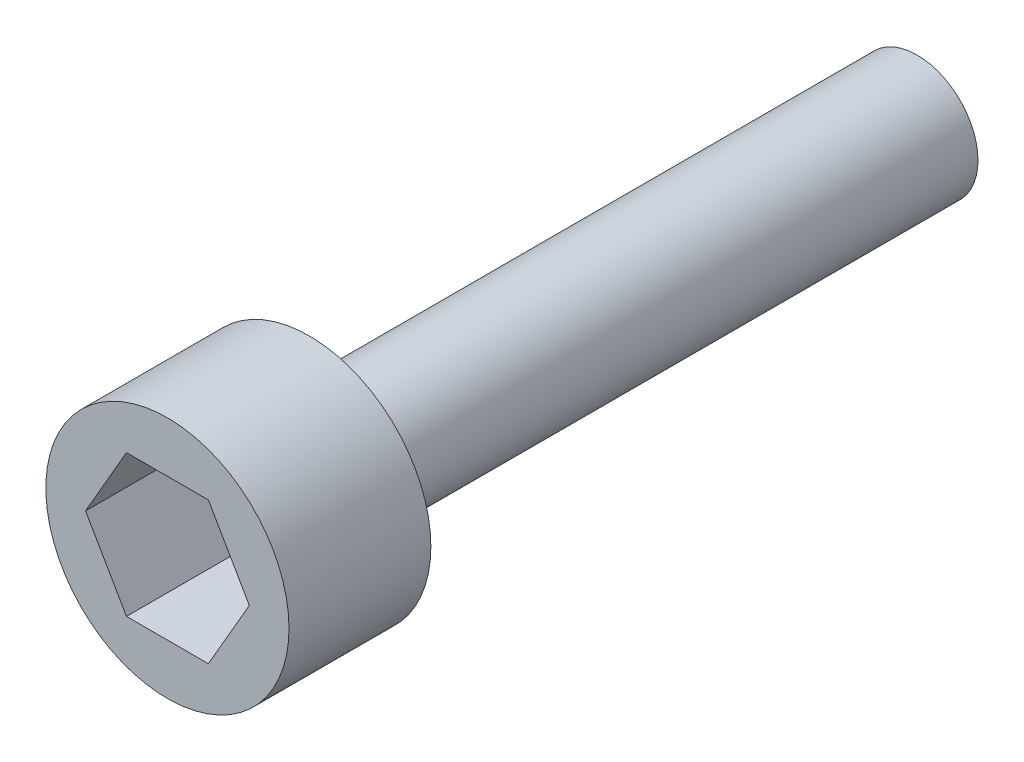
ISO-10303-21;
HEADER;
FILE_DESCRIPTION(('STEP AP214'),'2;1');
FILE_NAME('part.step','',(''),(''),'','','');
FILE_SCHEMA(('AUTOMOTIVE_DESIGN { 1 0 10303 214 1 1 1 1 }'));
ENDSEC;
DATA;
#1=APPLICATION_CONTEXT('core data for automotive mechanical design processes');
#2=APPLICATION_PROTOCOL_DEFINITION('international standard','automotive_design',2000,#1);
#3=PRODUCT_CONTEXT('',#1,'mechanical');
#4=PRODUCT('Part','Part','',(#3));
#5=PRODUCT_RELATED_PRODUCT_CATEGORY('part','',(#4));
#6=PRODUCT_DEFINITION_FORMATION('','',#4);
#7=PRODUCT_DEFINITION_CONTEXT('part definition',#1,'design');
#8=PRODUCT_DEFINITION('design','',#6,#7);
#9=PRODUCT_DEFINITION_SHAPE('','',#8);
#10=(LENGTH_UNIT() NAMED_UNIT(*) SI_UNIT(.MILLI.,.METRE.));
#11=(NAMED_UNIT(*) PLANE_ANGLE_UNIT() SI_UNIT($,.RADIAN.));
#12=(NAMED_UNIT(*) SI_UNIT($,.STERADIAN.) SOLID_ANGLE_UNIT());
#13=UNCERTAINTY_MEASURE_WITH_UNIT(LENGTH_MEASURE(1.E-05),#10,'distance_accuracy_value','');
#14=(GEOMETRIC_REPRESENTATION_CONTEXT(3) GLOBAL_UNCERTAINTY_ASSIGNED_CONTEXT((#13)) GLOBAL_UNIT_ASSIGNED_CONTEXT((#10,
#11,#12)) REPRESENTATION_CONTEXT('',''));
#15=CARTESIAN_POINT('',(0.,0.,0.));
#16=DIRECTION('',(0.,0.,1.));
#17=DIRECTION('',(1.,0.,0.));
#18=AXIS2_PLACEMENT_3D('',#15,#16,#17);
#19=CARTESIAN_POINT('',(0.,0.,3.5));
#20=DIRECTION('',(0.,0.,-1.));
#21=DIRECTION('',(-1.,0.,0.));
#22=AXIS2_PLACEMENT_3D('',#19,#20,#21);
#23=CYLINDRICAL_SURFACE('',#22,3.);
#24=CARTESIAN_POINT('',(0.,0.,3.5));
#25=DIRECTION('',(0.,0.,1.));
#26=DIRECTION('',(1.,0.,0.));
#27=AXIS2_PLACEMENT_3D('',#24,#25,#26);
#28=CIRCLE('',#27,3.);
#29=CARTESIAN_POINT('',(3.,0.,3.5));
#30=VERTEX_POINT('',#29);
#31=EDGE_CURVE('E11',#30,#30,#28,.T.);
#32=ORIENTED_EDGE('',*,*,#31,.F.);
#33=EDGE_LOOP('',(#32));
#34=FACE_BOUND('',#33,.T.);
#35=CARTESIAN_POINT('',(0.,0.,0.));
#36=DIRECTION('',(0.,0.,1.));
#37=DIRECTION('',(1.,0.,0.));
#38=AXIS2_PLACEMENT_3D('',#35,#36,#37);
#39=CIRCLE('',#38,3.);
#40=CARTESIAN_POINT('',(3.,0.,0.));
#41=VERTEX_POINT('',#40);
#42=EDGE_CURVE('E38',#41,#41,#39,.T.);
#43=ORIENTED_EDGE('',*,*,#42,.T.);
#44=EDGE_LOOP('',(#43));
#45=FACE_BOUND('',#44,.T.);
#46=ADVANCED_FACE('F35',(#34,#45),#23,.T.);
#47=CARTESIAN_POINT('',(0.,0.,3.5));
#48=DIRECTION('',(0.,0.,1.));
#49=DIRECTION('',(1.,0.,0.));
#50=AXIS2_PLACEMENT_3D('',#47,#48,#49);
#51=PLANE('',#50);
#52=DIRECTION('',(-0.499999999999528,-0.866025403784711,0.));
#53=VECTOR('',#52,1.);
#54=CARTESIAN_POINT('',(-2.02072594216261,2.1557411053031E-12,3.5));
#55=LINE('',#54,#53);
#56=CARTESIAN_POINT('',(-1.01036297108294,1.75000000000058,3.5));
#57=VERTEX_POINT('',#56);
#58=CARTESIAN_POINT('',(-2.02072594216261,2.15561075933568E-12,3.5));
#59=VERTEX_POINT('',#58);
#60=EDGE_CURVE('E49',#57,#59,#55,.T.);
#61=ORIENTED_EDGE('',*,*,#60,.F.);
#62=DIRECTION('',(-1.,-7.11024037944377E-13,0.));
#63=VECTOR('',#62,1.);
#64=CARTESIAN_POINT('',(-1.01036297108294,1.75000000000058,3.5));
#65=LINE('',#64,#63);
#66=CARTESIAN_POINT('',(1.01036297108301,1.75000000000202,3.5));
#67=VERTEX_POINT('',#66);
#68=EDGE_CURVE('E133',#67,#57,#65,.T.);
#69=ORIENTED_EDGE('',*,*,#68,.F.);
#70=DIRECTION('',(-0.50000000000043,0.86602540378419,0.));
#71=VECTOR('',#70,1.);
#72=CARTESIAN_POINT('',(1.01036297108301,1.75000000000202,3.5));
#73=LINE('',#72,#71);
#74=CARTESIAN_POINT('',(2.02072594216593,2.15574110530311E-12,3.5));
#75=VERTEX_POINT('',#74);
#76=EDGE_CURVE('E131',#75,#67,#73,.T.);
#77=ORIENTED_EDGE('',*,*,#76,.F.);
#78=DIRECTION('',(0.499999999999527,0.866025403784711,0.));
#79=VECTOR('',#78,1.);
#80=CARTESIAN_POINT('',(2.02072594216593,2.15574110530311E-12,3.5));
#81=LINE('',#80,#79);
#82=CARTESIAN_POINT('',(1.01036297108301,-1.75000000000192,3.5));
#83=VERTEX_POINT('',#82);
#84=EDGE_CURVE('E97',#83,#75,#81,.T.);
#85=ORIENTED_EDGE('',*,*,#84,.F.);
#86=DIRECTION('',(1.,7.11024037946673E-13,0.));
#87=VECTOR('',#86,1.);
#88=CARTESIAN_POINT('',(1.01036297108301,-1.75000000000192,3.5));
#89=LINE('',#88,#87);
#90=CARTESIAN_POINT('',(-1.01036297107642,-1.75000000000336,3.5));
#91=VERTEX_POINT('',#90);
#92=EDGE_CURVE('E127',#91,#83,#89,.T.);
#93=ORIENTED_EDGE('',*,*,#92,.F.);
#94=DIRECTION('',(0.500000000000431,-0.86602540378419,0.));
#95=VECTOR('',#94,1.);
#96=CARTESIAN_POINT('',(-1.01036297107642,-1.75000000000336,3.5));
#97=LINE('',#96,#95);
#98=EDGE_CURVE('E123',#59,#91,#97,.T.);
#99=ORIENTED_EDGE('',*,*,#98,.F.);
#100=EDGE_LOOP('',(#61,#69,#77,#85,#93,#99));
#101=FACE_BOUND('',#100,.T.);
#102=ORIENTED_EDGE('',*,*,#31,.T.);
#103=EDGE_LOOP('',(#102));
#104=FACE_BOUND('',#103,.T.);
#105=ADVANCED_FACE('F146',(#101,#104),#51,.T.);
#106=CARTESIAN_POINT('',(0.,0.,0.));
#107=DIRECTION('',(0.,0.,1.));
#108=DIRECTION('',(1.,0.,0.));
#109=AXIS2_PLACEMENT_3D('',#106,#107,#108);
#110=PLANE('',#109);
#111=CARTESIAN_POINT('',(0.,0.,0.));
#112=DIRECTION('',(0.,0.,1.));
#113=DIRECTION('',(1.,0.,0.));
#114=AXIS2_PLACEMENT_3D('',#111,#112,#113);
#115=CIRCLE('',#114,1.5);
#116=CARTESIAN_POINT('',(1.5,0.,0.));
#117=VERTEX_POINT('',#116);
#118=EDGE_CURVE('E153',#117,#117,#115,.T.);
#119=ORIENTED_EDGE('',*,*,#118,.T.);
#120=EDGE_LOOP('',(#119));
#121=FACE_BOUND('',#120,.T.);
#122=ORIENTED_EDGE('',*,*,#42,.F.);
#123=EDGE_LOOP('',(#122));
#124=FACE_BOUND('',#123,.T.);
#125=ADVANCED_FACE('F174',(#121,#124),#110,.F.);
#126=CARTESIAN_POINT('',(-2.02072594216261,2.1557411053031E-12,0.7));
#127=DIRECTION('',(-0.866025403784711,0.499999999999528,0.));
#128=DIRECTION('',(-0.499999999999528,-0.866025403784711,0.));
#129=AXIS2_PLACEMENT_3D('',#126,#127,#128);
#130=PLANE('',#129);
#131=ORIENTED_EDGE('',*,*,#60,.T.);
#132=DIRECTION('',(0.,0.,1.));
#133=VECTOR('',#132,1.);
#134=CARTESIAN_POINT('',(-2.02072594216261,2.1557411053031E-12,0.7));
#135=LINE('',#134,#133);
#136=CARTESIAN_POINT('',(-2.02072594216261,2.1557411053031E-12,0.7));
#137=VERTEX_POINT('',#136);
#138=EDGE_CURVE('E79',#137,#59,#135,.T.);
#139=ORIENTED_EDGE('',*,*,#138,.F.);
#140=DIRECTION('',(-0.499999999999528,-0.866025403784711,0.));
#141=VECTOR('',#140,1.);
#142=CARTESIAN_POINT('',(-2.02072594216261,2.1557411053031E-12,0.7));
#143=LINE('',#142,#141);
#144=CARTESIAN_POINT('',(-1.01036297108294,1.75000000000058,0.7));
#145=VERTEX_POINT('',#144);
#146=EDGE_CURVE('E135',#145,#137,#143,.T.);
#147=ORIENTED_EDGE('',*,*,#146,.F.);
#148=DIRECTION('',(0.,0.,1.));
#149=VECTOR('',#148,1.);
#150=CARTESIAN_POINT('',(-1.01036297108294,1.75000000000058,0.7));
#151=LINE('',#150,#149);
#152=EDGE_CURVE('E57',#145,#57,#151,.T.);
#153=ORIENTED_EDGE('',*,*,#152,.T.);
#154=EDGE_LOOP('',(#131,#139,#147,#153));
#155=FACE_BOUND('',#154,.T.);
#156=ADVANCED_FACE('F182',(#155),#130,.F.);
#157=CARTESIAN_POINT('',(-1.01036297108294,1.75000000000058,0.7));
#158=DIRECTION('',(-7.11024037944377E-13,1.,0.));
#159=DIRECTION('',(-1.,-7.11024037944377E-13,0.));
#160=AXIS2_PLACEMENT_3D('',#157,#158,#159);
#161=PLANE('',#160);
#162=ORIENTED_EDGE('',*,*,#68,.T.);
#163=ORIENTED_EDGE('',*,*,#152,.F.);
#164=DIRECTION('',(-1.,-7.11024037944377E-13,0.));
#165=VECTOR('',#164,1.);
#166=CARTESIAN_POINT('',(-1.01036297108294,1.75000000000058,0.7));
#167=LINE('',#166,#165);
#168=CARTESIAN_POINT('',(1.01036297108301,1.75000000000202,0.7));
#169=VERTEX_POINT('',#168);
#170=EDGE_CURVE('E109',#169,#145,#167,.T.);
#171=ORIENTED_EDGE('',*,*,#170,.F.);
#172=DIRECTION('',(0.,0.,1.));
#173=VECTOR('',#172,1.);
#174=CARTESIAN_POINT('',(1.01036297108301,1.75000000000202,0.7));
#175=LINE('',#174,#173);
#176=EDGE_CURVE('E101',#169,#67,#175,.T.);
#177=ORIENTED_EDGE('',*,*,#176,.T.);
#178=EDGE_LOOP('',(#162,#163,#171,#177));
#179=FACE_BOUND('',#178,.T.);
#180=ADVANCED_FACE('F187',(#179),#161,.F.);
#181=CARTESIAN_POINT('',(1.01036297108301,1.75000000000202,0.7));
#182=DIRECTION('',(0.86602540378419,0.50000000000043,0.));
#183=DIRECTION('',(-0.50000000000043,0.86602540378419,0.));
#184=AXIS2_PLACEMENT_3D('',#181,#182,#183);
#185=PLANE('',#184);
#186=ORIENTED_EDGE('',*,*,#76,.T.);
#187=ORIENTED_EDGE('',*,*,#176,.F.);
#188=DIRECTION('',(-0.50000000000043,0.86602540378419,0.));
#189=VECTOR('',#188,1.);
#190=CARTESIAN_POINT('',(1.01036297108301,1.75000000000202,0.7));
#191=LINE('',#190,#189);
#192=CARTESIAN_POINT('',(2.02072594216593,2.15574110530311E-12,0.7));
#193=VERTEX_POINT('',#192);
#194=EDGE_CURVE('E105',#193,#169,#191,.T.);
#195=ORIENTED_EDGE('',*,*,#194,.F.);
#196=DIRECTION('',(0.,0.,1.));
#197=VECTOR('',#196,1.);
#198=CARTESIAN_POINT('',(2.02072594216593,2.15574110530311E-12,0.7));
#199=LINE('',#198,#197);
#200=EDGE_CURVE('E90',#193,#75,#199,.T.);
#201=ORIENTED_EDGE('',*,*,#200,.T.);
#202=EDGE_LOOP('',(#186,#187,#195,#201));
#203=FACE_BOUND('',#202,.T.);
#204=ADVANCED_FACE('F106',(#203),#185,.F.);
#205=CARTESIAN_POINT('',(2.02072594216593,2.15574110530311E-12,0.7));
#206=DIRECTION('',(0.866025403784712,-0.499999999999527,0.));
#207=DIRECTION('',(0.499999999999527,0.866025403784712,0.));
#208=AXIS2_PLACEMENT_3D('',#205,#206,#207);
#209=PLANE('',#208);
#210=ORIENTED_EDGE('',*,*,#84,.T.);
#211=ORIENTED_EDGE('',*,*,#200,.F.);
#212=DIRECTION('',(0.499999999999527,0.866025403784711,0.));
#213=VECTOR('',#212,1.);
#214=CARTESIAN_POINT('',(2.02072594216593,2.15574110530311E-12,0.7));
#215=LINE('',#214,#213);
#216=CARTESIAN_POINT('',(1.01036297108301,-1.75000000000192,0.7));
#217=VERTEX_POINT('',#216);
#218=EDGE_CURVE('E94',#217,#193,#215,.T.);
#219=ORIENTED_EDGE('',*,*,#218,.F.);
#220=DIRECTION('',(0.,0.,1.));
#221=VECTOR('',#220,1.);
#222=CARTESIAN_POINT('',(1.01036297108301,-1.75000000000192,0.7));
#223=LINE('',#222,#221);
#224=EDGE_CURVE('E102',#217,#83,#223,.T.);
#225=ORIENTED_EDGE('',*,*,#224,.T.);
#226=EDGE_LOOP('',(#210,#211,#219,#225));
#227=FACE_BOUND('',#226,.T.);
#228=ADVANCED_FACE('F92',(#227),#209,.F.);
#229=CARTESIAN_POINT('',(1.01036297108301,-1.75000000000192,0.7));
#230=DIRECTION('',(7.11024037946673E-13,-1.,0.));
#231=DIRECTION('',(1.,7.11024037946673E-13,0.));
#232=AXIS2_PLACEMENT_3D('',#229,#230,#231);
#233=PLANE('',#232);
#234=ORIENTED_EDGE('',*,*,#92,.T.);
#235=ORIENTED_EDGE('',*,*,#224,.F.);
#236=DIRECTION('',(1.,7.11024037946673E-13,0.));
#237=VECTOR('',#236,1.);
#238=CARTESIAN_POINT('',(1.01036297108301,-1.75000000000192,0.7));
#239=LINE('',#238,#237);
#240=CARTESIAN_POINT('',(-1.01036297107642,-1.75000000000336,0.7));
#241=VERTEX_POINT('',#240);
#242=EDGE_CURVE('E115',#241,#217,#239,.T.);
#243=ORIENTED_EDGE('',*,*,#242,.F.);
#244=DIRECTION('',(0.,0.,1.));
#245=VECTOR('',#244,1.);
#246=CARTESIAN_POINT('',(-1.01036297107642,-1.75000000000336,0.7));
#247=LINE('',#246,#245);
#248=EDGE_CURVE('E139',#241,#91,#247,.T.);
#249=ORIENTED_EDGE('',*,*,#248,.T.);
#250=EDGE_LOOP('',(#234,#235,#243,#249));
#251=FACE_BOUND('',#250,.T.);
#252=ADVANCED_FACE('F150',(#251),#233,.F.);
#253=CARTESIAN_POINT('',(-1.01036297107642,-1.75000000000336,0.7));
#254=DIRECTION('',(-0.86602540378419,-0.500000000000431,0.));
#255=DIRECTION('',(0.500000000000431,-0.86602540378419,0.));
#256=AXIS2_PLACEMENT_3D('',#253,#254,#255);
#257=PLANE('',#256);
#258=ORIENTED_EDGE('',*,*,#98,.T.);
#259=ORIENTED_EDGE('',*,*,#248,.F.);
#260=DIRECTION('',(0.500000000000431,-0.86602540378419,0.));
#261=VECTOR('',#260,1.);
#262=CARTESIAN_POINT('',(-1.01036297107642,-1.75000000000336,0.7));
#263=LINE('',#262,#261);
#264=EDGE_CURVE('E117',#137,#241,#263,.T.);
#265=ORIENTED_EDGE('',*,*,#264,.F.);
#266=ORIENTED_EDGE('',*,*,#138,.T.);
#267=EDGE_LOOP('',(#258,#259,#265,#266));
#268=FACE_BOUND('',#267,.T.);
#269=ADVANCED_FACE('F143',(#268),#257,.F.);
#270=CARTESIAN_POINT('',(-1.01036297108294,1.75000000000058,0.7));
#271=DIRECTION('',(0.,0.,-1.));
#272=DIRECTION('',(-1.,0.,0.));
#273=AXIS2_PLACEMENT_3D('',#270,#271,#272);
#274=PLANE('',#273);
#275=ORIENTED_EDGE('',*,*,#146,.T.);
#276=ORIENTED_EDGE('',*,*,#264,.T.);
#277=ORIENTED_EDGE('',*,*,#242,.T.);
#278=ORIENTED_EDGE('',*,*,#218,.T.);
#279=ORIENTED_EDGE('',*,*,#194,.T.);
#280=ORIENTED_EDGE('',*,*,#170,.T.);
#281=EDGE_LOOP('',(#275,#276,#277,#278,#279,#280));
#282=FACE_BOUND('',#281,.T.);
#283=ADVANCED_FACE('F112',(#282),#274,.F.);
#284=CARTESIAN_POINT('',(0.,0.,-15.));
#285=DIRECTION('',(0.,0.,1.));
#286=DIRECTION('',(1.,0.,0.));
#287=AXIS2_PLACEMENT_3D('',#284,#285,#286);
#288=CYLINDRICAL_SURFACE('',#287,1.5);
#289=CARTESIAN_POINT('',(0.,0.,-15.));
#290=DIRECTION('',(0.,0.,1.));
#291=DIRECTION('',(1.,0.,0.));
#292=AXIS2_PLACEMENT_3D('',#289,#290,#291);
#293=CIRCLE('',#292,1.5);
#294=CARTESIAN_POINT('',(1.5,0.,-15.));
#295=VERTEX_POINT('',#294);
#296=EDGE_CURVE('E124',#295,#295,#293,.T.);
#297=ORIENTED_EDGE('',*,*,#296,.T.);
#298=EDGE_LOOP('',(#297));
#299=FACE_BOUND('',#298,.T.);
#300=ORIENTED_EDGE('',*,*,#118,.F.);
#301=EDGE_LOOP('',(#300));
#302=FACE_BOUND('',#301,.T.);
#303=ADVANCED_FACE('F159',(#299,#302),#288,.T.);
#304=CARTESIAN_POINT('',(0.,0.,-15.));
#305=DIRECTION('',(0.,0.,1.));
#306=DIRECTION('',(1.,0.,0.));
#307=AXIS2_PLACEMENT_3D('',#304,#305,#306);
#308=PLANE('',#307);
#309=ORIENTED_EDGE('',*,*,#296,.F.);
#310=EDGE_LOOP('',(#309));
#311=FACE_BOUND('',#310,.T.);
#312=ADVANCED_FACE('F162',(#311),#308,.F.);
#313=CLOSED_SHELL('',(#46,#105,#125,#156,#180,#204,#228,#252,#269,#283,#303,#312));
#314=MANIFOLD_SOLID_BREP('B2',#313);
#315=ADVANCED_BREP_SHAPE_REPRESENTATION('',(#18,#314),#14);
#316=SHAPE_DEFINITION_REPRESENTATION(#9,#315);
ENDSEC;
END-ISO-10303-21;
